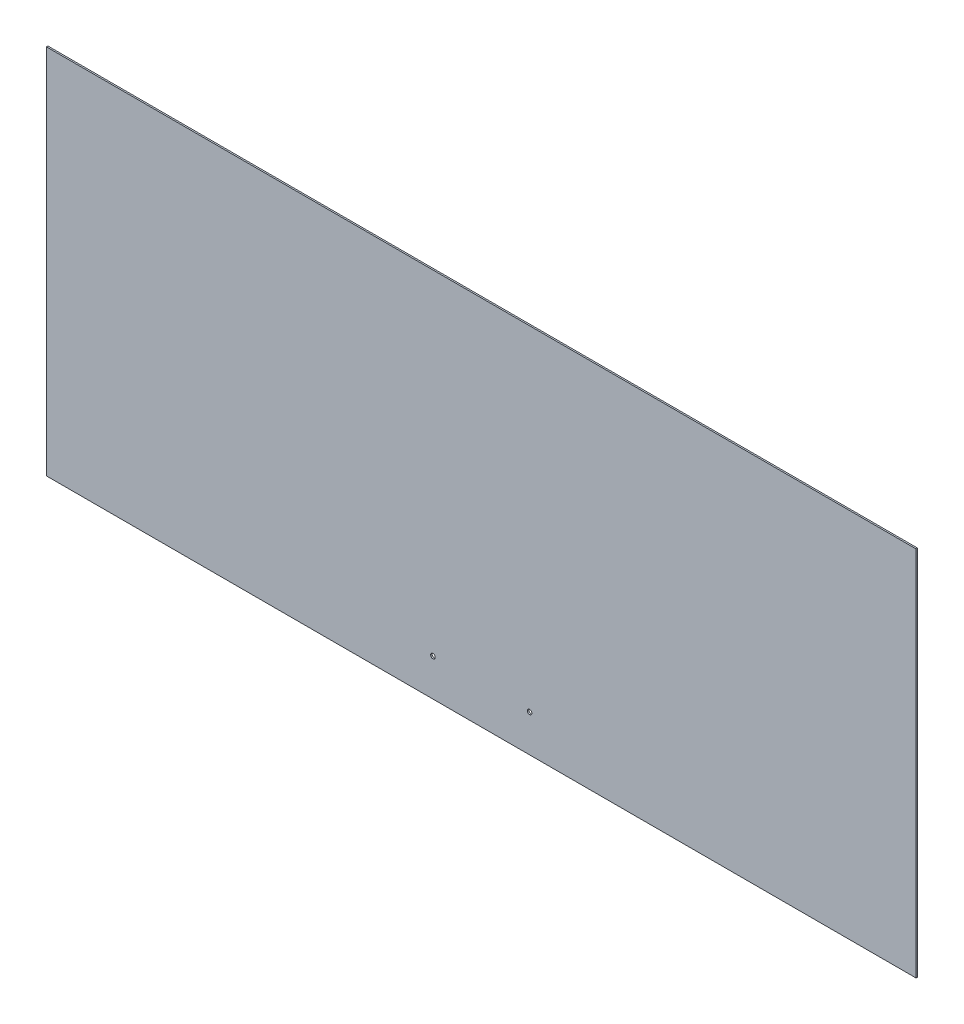
ISO-10303-21;
HEADER;
FILE_DESCRIPTION(('STEP AP214'),'2;1');
FILE_NAME('part.step','',(''),(''),'','','');
FILE_SCHEMA(('AUTOMOTIVE_DESIGN { 1 0 10303 214 1 1 1 1 }'));
ENDSEC;
DATA;
#1=APPLICATION_CONTEXT('core data for automotive mechanical design processes');
#2=APPLICATION_PROTOCOL_DEFINITION('international standard','automotive_design',2000,#1);
#3=PRODUCT_CONTEXT('',#1,'mechanical');
#4=PRODUCT('Part','Part','',(#3));
#5=PRODUCT_RELATED_PRODUCT_CATEGORY('part','',(#4));
#6=PRODUCT_DEFINITION_FORMATION('','',#4);
#7=PRODUCT_DEFINITION_CONTEXT('part definition',#1,'design');
#8=PRODUCT_DEFINITION('design','',#6,#7);
#9=PRODUCT_DEFINITION_SHAPE('','',#8);
#10=(LENGTH_UNIT() NAMED_UNIT(*) SI_UNIT(.MILLI.,.METRE.));
#11=(NAMED_UNIT(*) PLANE_ANGLE_UNIT() SI_UNIT($,.RADIAN.));
#12=(NAMED_UNIT(*) SI_UNIT($,.STERADIAN.) SOLID_ANGLE_UNIT());
#13=UNCERTAINTY_MEASURE_WITH_UNIT(LENGTH_MEASURE(1.E-05),#10,'distance_accuracy_value','');
#14=(GEOMETRIC_REPRESENTATION_CONTEXT(3) GLOBAL_UNCERTAINTY_ASSIGNED_CONTEXT((#13)) GLOBAL_UNIT_ASSIGNED_CONTEXT((#10,
#11,#12)) REPRESENTATION_CONTEXT('',''));
#15=CARTESIAN_POINT('',(0.,0.,0.));
#16=DIRECTION('',(0.,0.,1.));
#17=DIRECTION('',(1.,0.,0.));
#18=AXIS2_PLACEMENT_3D('',#15,#16,#17);
#19=CARTESIAN_POINT('',(0.,0.,2.));
#20=DIRECTION('',(1.,0.,0.));
#21=DIRECTION('',(0.,0.,-1.));
#22=AXIS2_PLACEMENT_3D('',#19,#20,#21);
#23=PLANE('',#22);
#24=DIRECTION('',(0.,-1.,0.));
#25=VECTOR('',#24,1.);
#26=CARTESIAN_POINT('',(0.,0.,0.));
#27=LINE('',#26,#25);
#28=CARTESIAN_POINT('',(0.,0.,0.));
#29=VERTEX_POINT('',#28);
#30=CARTESIAN_POINT('',(0.,-500.,0.));
#31=VERTEX_POINT('',#30);
#32=EDGE_CURVE('E100',#29,#31,#27,.T.);
#33=ORIENTED_EDGE('',*,*,#32,.T.);
#34=DIRECTION('',(0.,0.,-1.));
#35=VECTOR('',#34,1.);
#36=CARTESIAN_POINT('',(0.,-500.,2.));
#37=LINE('',#36,#35);
#38=CARTESIAN_POINT('',(0.,-500.,2.));
#39=VERTEX_POINT('',#38);
#40=EDGE_CURVE('E11',#39,#31,#37,.T.);
#41=ORIENTED_EDGE('',*,*,#40,.F.);
#42=DIRECTION('',(0.,-1.,0.));
#43=VECTOR('',#42,1.);
#44=CARTESIAN_POINT('',(0.,0.,2.));
#45=LINE('',#44,#43);
#46=CARTESIAN_POINT('',(0.,0.,2.));
#47=VERTEX_POINT('',#46);
#48=EDGE_CURVE('E88',#47,#39,#45,.T.);
#49=ORIENTED_EDGE('',*,*,#48,.F.);
#50=DIRECTION('',(0.,0.,-1.));
#51=VECTOR('',#50,1.);
#52=CARTESIAN_POINT('',(0.,0.,2.));
#53=LINE('',#52,#51);
#54=EDGE_CURVE('E96',#47,#29,#53,.T.);
#55=ORIENTED_EDGE('',*,*,#54,.T.);
#56=EDGE_LOOP('',(#33,#41,#49,#55));
#57=FACE_BOUND('',#56,.T.);
#58=ADVANCED_FACE('F37',(#57),#23,.F.);
#59=CARTESIAN_POINT('',(0.,-500.,2.));
#60=DIRECTION('',(0.,1.,0.));
#61=DIRECTION('',(0.,0.,1.));
#62=AXIS2_PLACEMENT_3D('',#59,#60,#61);
#63=PLANE('',#62);
#64=DIRECTION('',(1.,0.,0.));
#65=VECTOR('',#64,1.);
#66=CARTESIAN_POINT('',(0.,-500.,0.));
#67=LINE('',#66,#65);
#68=CARTESIAN_POINT('',(1170.,-500.,0.));
#69=VERTEX_POINT('',#68);
#70=EDGE_CURVE('E92',#31,#69,#67,.T.);
#71=ORIENTED_EDGE('',*,*,#70,.T.);
#72=DIRECTION('',(0.,0.,-1.));
#73=VECTOR('',#72,1.);
#74=CARTESIAN_POINT('',(1170.,-500.,2.));
#75=LINE('',#74,#73);
#76=CARTESIAN_POINT('',(1170.,-500.,2.));
#77=VERTEX_POINT('',#76);
#78=EDGE_CURVE('E45',#77,#69,#75,.T.);
#79=ORIENTED_EDGE('',*,*,#78,.F.);
#80=DIRECTION('',(1.,0.,0.));
#81=VECTOR('',#80,1.);
#82=CARTESIAN_POINT('',(0.,-500.,2.));
#83=LINE('',#82,#81);
#84=EDGE_CURVE('E83',#39,#77,#83,.T.);
#85=ORIENTED_EDGE('',*,*,#84,.F.);
#86=ORIENTED_EDGE('',*,*,#40,.T.);
#87=EDGE_LOOP('',(#71,#79,#85,#86));
#88=FACE_BOUND('',#87,.T.);
#89=ADVANCED_FACE('F91',(#88),#63,.F.);
#90=CARTESIAN_POINT('',(1170.,0.,2.));
#91=DIRECTION('',(-1.,0.,0.));
#92=DIRECTION('',(0.,0.,1.));
#93=AXIS2_PLACEMENT_3D('',#90,#91,#92);
#94=PLANE('',#93);
#95=DIRECTION('',(0.,1.,0.));
#96=VECTOR('',#95,1.);
#97=CARTESIAN_POINT('',(1170.,0.,0.));
#98=LINE('',#97,#96);
#99=CARTESIAN_POINT('',(1170.,0.,0.));
#100=VERTEX_POINT('',#99);
#101=EDGE_CURVE('E70',#69,#100,#98,.T.);
#102=ORIENTED_EDGE('',*,*,#101,.T.);
#103=DIRECTION('',(0.,0.,-1.));
#104=VECTOR('',#103,1.);
#105=CARTESIAN_POINT('',(1170.,0.,2.));
#106=LINE('',#105,#104);
#107=CARTESIAN_POINT('',(1170.,0.,2.));
#108=VERTEX_POINT('',#107);
#109=EDGE_CURVE('E93',#108,#100,#106,.T.);
#110=ORIENTED_EDGE('',*,*,#109,.F.);
#111=DIRECTION('',(0.,1.,0.));
#112=VECTOR('',#111,1.);
#113=CARTESIAN_POINT('',(1170.,0.,2.));
#114=LINE('',#113,#112);
#115=EDGE_CURVE('E86',#77,#108,#114,.T.);
#116=ORIENTED_EDGE('',*,*,#115,.F.);
#117=ORIENTED_EDGE('',*,*,#78,.T.);
#118=EDGE_LOOP('',(#102,#110,#116,#117));
#119=FACE_BOUND('',#118,.T.);
#120=ADVANCED_FACE('F94',(#119),#94,.F.);
#121=CARTESIAN_POINT('',(0.,0.,2.));
#122=DIRECTION('',(0.,-1.,0.));
#123=DIRECTION('',(0.,0.,-1.));
#124=AXIS2_PLACEMENT_3D('',#121,#122,#123);
#125=PLANE('',#124);
#126=DIRECTION('',(-1.,0.,0.));
#127=VECTOR('',#126,1.);
#128=CARTESIAN_POINT('',(0.,0.,0.));
#129=LINE('',#128,#127);
#130=EDGE_CURVE('E76',#100,#29,#129,.T.);
#131=ORIENTED_EDGE('',*,*,#130,.T.);
#132=ORIENTED_EDGE('',*,*,#54,.F.);
#133=DIRECTION('',(-1.,0.,0.));
#134=VECTOR('',#133,1.);
#135=CARTESIAN_POINT('',(0.,0.,2.));
#136=LINE('',#135,#134);
#137=EDGE_CURVE('E53',#108,#47,#136,.T.);
#138=ORIENTED_EDGE('',*,*,#137,.F.);
#139=ORIENTED_EDGE('',*,*,#109,.T.);
#140=EDGE_LOOP('',(#131,#132,#138,#139));
#141=FACE_BOUND('',#140,.T.);
#142=ADVANCED_FACE('F108',(#141),#125,.F.);
#143=CARTESIAN_POINT('',(0.,0.,2.));
#144=DIRECTION('',(0.,0.,1.));
#145=DIRECTION('',(1.,0.,0.));
#146=AXIS2_PLACEMENT_3D('',#143,#144,#145);
#147=PLANE('',#146);
#148=CARTESIAN_POINT('',(520.,-450.,2.));
#149=DIRECTION('',(0.,0.,1.));
#150=DIRECTION('',(1.,0.,0.));
#151=AXIS2_PLACEMENT_3D('',#148,#149,#150);
#152=CIRCLE('',#151,3.09999999999999);
#153=CARTESIAN_POINT('',(523.1,-450.,2.));
#154=VERTEX_POINT('',#153);
#155=EDGE_CURVE('E120',#154,#154,#152,.T.);
#156=ORIENTED_EDGE('',*,*,#155,.F.);
#157=EDGE_LOOP('',(#156));
#158=FACE_BOUND('',#157,.T.);
#159=CARTESIAN_POINT('',(650.,-450.,2.));
#160=DIRECTION('',(0.,0.,1.));
#161=DIRECTION('',(1.,0.,0.));
#162=AXIS2_PLACEMENT_3D('',#159,#160,#161);
#163=CIRCLE('',#162,3.09999999999999);
#164=CARTESIAN_POINT('',(653.1,-450.,2.));
#165=VERTEX_POINT('',#164);
#166=EDGE_CURVE('E117',#165,#165,#163,.T.);
#167=ORIENTED_EDGE('',*,*,#166,.F.);
#168=EDGE_LOOP('',(#167));
#169=FACE_BOUND('',#168,.T.);
#170=ORIENTED_EDGE('',*,*,#48,.T.);
#171=ORIENTED_EDGE('',*,*,#84,.T.);
#172=ORIENTED_EDGE('',*,*,#115,.T.);
#173=ORIENTED_EDGE('',*,*,#137,.T.);
#174=EDGE_LOOP('',(#170,#171,#172,#173));
#175=FACE_BOUND('',#174,.T.);
#176=ADVANCED_FACE('F84',(#158,#169,#175),#147,.T.);
#177=CARTESIAN_POINT('',(0.,0.,0.));
#178=DIRECTION('',(0.,0.,1.));
#179=DIRECTION('',(1.,0.,0.));
#180=AXIS2_PLACEMENT_3D('',#177,#178,#179);
#181=PLANE('',#180);
#182=CARTESIAN_POINT('',(520.,-450.,0.));
#183=DIRECTION('',(0.,0.,1.));
#184=DIRECTION('',(1.,0.,0.));
#185=AXIS2_PLACEMENT_3D('',#182,#183,#184);
#186=CIRCLE('',#185,3.09999999999999);
#187=CARTESIAN_POINT('',(523.1,-450.,0.));
#188=VERTEX_POINT('',#187);
#189=EDGE_CURVE('E103',#188,#188,#186,.T.);
#190=ORIENTED_EDGE('',*,*,#189,.T.);
#191=EDGE_LOOP('',(#190));
#192=FACE_BOUND('',#191,.T.);
#193=CARTESIAN_POINT('',(650.,-450.,0.));
#194=DIRECTION('',(0.,0.,1.));
#195=DIRECTION('',(1.,0.,0.));
#196=AXIS2_PLACEMENT_3D('',#193,#194,#195);
#197=CIRCLE('',#196,3.09999999999999);
#198=CARTESIAN_POINT('',(653.1,-450.,0.));
#199=VERTEX_POINT('',#198);
#200=EDGE_CURVE('E114',#199,#199,#197,.T.);
#201=ORIENTED_EDGE('',*,*,#200,.T.);
#202=EDGE_LOOP('',(#201));
#203=FACE_BOUND('',#202,.T.);
#204=ORIENTED_EDGE('',*,*,#32,.F.);
#205=ORIENTED_EDGE('',*,*,#130,.F.);
#206=ORIENTED_EDGE('',*,*,#101,.F.);
#207=ORIENTED_EDGE('',*,*,#70,.F.);
#208=EDGE_LOOP('',(#204,#205,#206,#207));
#209=FACE_BOUND('',#208,.T.);
#210=ADVANCED_FACE('F111',(#192,#203,#209),#181,.F.);
#211=CARTESIAN_POINT('',(650.,-450.,0.));
#212=DIRECTION('',(0.,0.,1.));
#213=DIRECTION('',(1.,0.,0.));
#214=AXIS2_PLACEMENT_3D('',#211,#212,#213);
#215=CYLINDRICAL_SURFACE('',#214,3.09999999999999);
#216=ORIENTED_EDGE('',*,*,#200,.F.);
#217=EDGE_LOOP('',(#216));
#218=FACE_BOUND('',#217,.T.);
#219=ORIENTED_EDGE('',*,*,#166,.T.);
#220=EDGE_LOOP('',(#219));
#221=FACE_BOUND('',#220,.T.);
#222=ADVANCED_FACE('F131',(#218,#221),#215,.F.);
#223=CARTESIAN_POINT('',(520.,-450.,0.));
#224=DIRECTION('',(0.,0.,1.));
#225=DIRECTION('',(1.,0.,0.));
#226=AXIS2_PLACEMENT_3D('',#223,#224,#225);
#227=CYLINDRICAL_SURFACE('',#226,3.09999999999999);
#228=ORIENTED_EDGE('',*,*,#189,.F.);
#229=EDGE_LOOP('',(#228));
#230=FACE_BOUND('',#229,.T.);
#231=ORIENTED_EDGE('',*,*,#155,.T.);
#232=EDGE_LOOP('',(#231));
#233=FACE_BOUND('',#232,.T.);
#234=ADVANCED_FACE('F128',(#230,#233),#227,.F.);
#235=CLOSED_SHELL('',(#58,#89,#120,#142,#176,#210,#222,#234));
#236=MANIFOLD_SOLID_BREP('B2',#235);
#237=ADVANCED_BREP_SHAPE_REPRESENTATION('',(#18,#236),#14);
#238=SHAPE_DEFINITION_REPRESENTATION(#9,#237);
ENDSEC;
END-ISO-10303-21;
